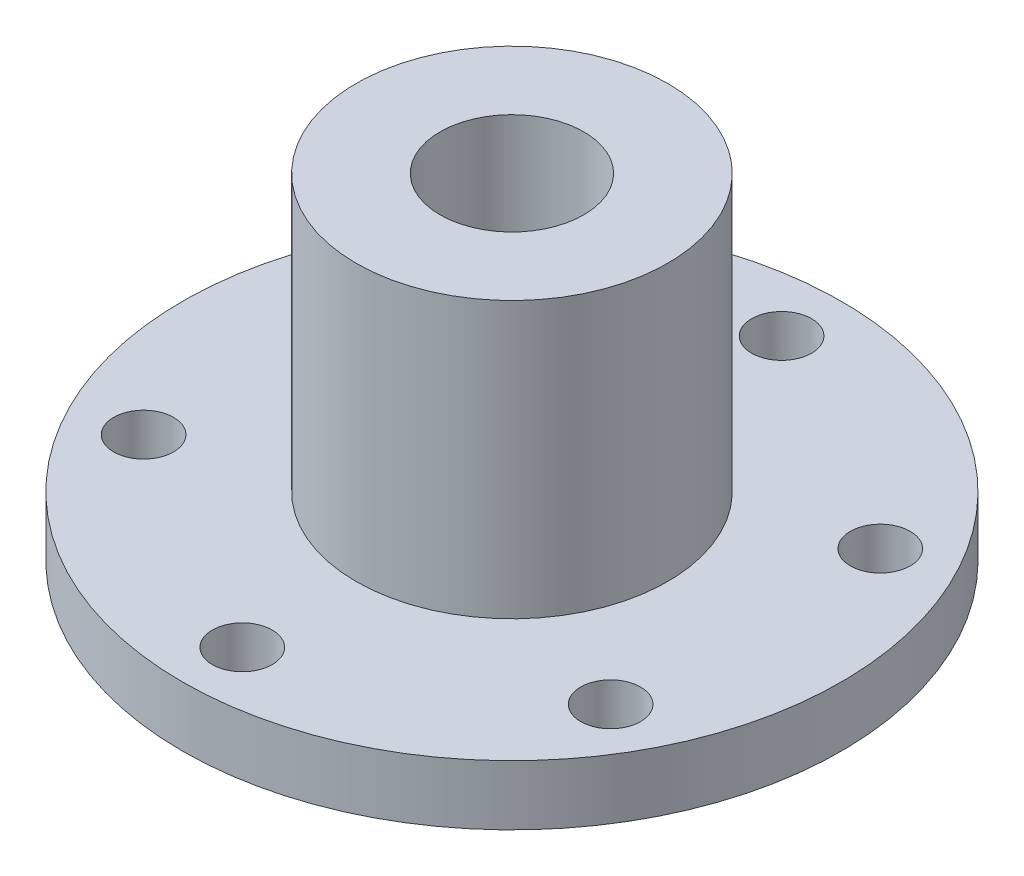
ISO-10303-21;
HEADER;
FILE_DESCRIPTION(('STEP AP214'),'2;1');
FILE_NAME('part.step','',(''),(''),'','','');
FILE_SCHEMA(('AUTOMOTIVE_DESIGN { 1 0 10303 214 1 1 1 1 }'));
ENDSEC;
DATA;
#1=APPLICATION_CONTEXT('core data for automotive mechanical design processes');
#2=APPLICATION_PROTOCOL_DEFINITION('international standard','automotive_design',2000,#1);
#3=PRODUCT_CONTEXT('',#1,'mechanical');
#4=PRODUCT('Part','Part','',(#3));
#5=PRODUCT_RELATED_PRODUCT_CATEGORY('part','',(#4));
#6=PRODUCT_DEFINITION_FORMATION('','',#4);
#7=PRODUCT_DEFINITION_CONTEXT('part definition',#1,'design');
#8=PRODUCT_DEFINITION('design','',#6,#7);
#9=PRODUCT_DEFINITION_SHAPE('','',#8);
#10=(LENGTH_UNIT() NAMED_UNIT(*) SI_UNIT(.MILLI.,.METRE.));
#11=(NAMED_UNIT(*) PLANE_ANGLE_UNIT() SI_UNIT($,.RADIAN.));
#12=(NAMED_UNIT(*) SI_UNIT($,.STERADIAN.) SOLID_ANGLE_UNIT());
#13=UNCERTAINTY_MEASURE_WITH_UNIT(LENGTH_MEASURE(1.E-05),#10,'distance_accuracy_value','');
#14=(GEOMETRIC_REPRESENTATION_CONTEXT(3) GLOBAL_UNCERTAINTY_ASSIGNED_CONTEXT((#13)) GLOBAL_UNIT_ASSIGNED_CONTEXT((#10,
#11,#12)) REPRESENTATION_CONTEXT('',''));
#15=CARTESIAN_POINT('',(0.,0.,0.));
#16=DIRECTION('',(0.,0.,1.));
#17=DIRECTION('',(1.,0.,0.));
#18=AXIS2_PLACEMENT_3D('',#15,#16,#17);
#19=CARTESIAN_POINT('',(0.,5.,0.));
#20=DIRECTION('',(0.,-1.,0.));
#21=DIRECTION('',(0.,0.,-1.));
#22=AXIS2_PLACEMENT_3D('',#19,#20,#21);
#23=CYLINDRICAL_SURFACE('',#22,27.5);
#24=CARTESIAN_POINT('',(0.,5.,0.));
#25=DIRECTION('',(0.,1.,0.));
#26=DIRECTION('',(0.,0.,1.));
#27=AXIS2_PLACEMENT_3D('',#24,#25,#26);
#28=CIRCLE('',#27,27.5);
#29=CARTESIAN_POINT('',(0.,5.,27.5));
#30=VERTEX_POINT('',#29);
#31=EDGE_CURVE('E51',#30,#30,#28,.T.);
#32=ORIENTED_EDGE('',*,*,#31,.F.);
#33=EDGE_LOOP('',(#32));
#34=FACE_BOUND('',#33,.T.);
#35=CARTESIAN_POINT('',(0.,0.,0.));
#36=DIRECTION('',(0.,1.,0.));
#37=DIRECTION('',(0.,0.,1.));
#38=AXIS2_PLACEMENT_3D('',#35,#36,#37);
#39=CIRCLE('',#38,27.5);
#40=CARTESIAN_POINT('',(0.,0.,27.5));
#41=VERTEX_POINT('',#40);
#42=EDGE_CURVE('E59',#41,#41,#39,.T.);
#43=ORIENTED_EDGE('',*,*,#42,.T.);
#44=EDGE_LOOP('',(#43));
#45=FACE_BOUND('',#44,.T.);
#46=ADVANCED_FACE('F39',(#34,#45),#23,.T.);
#47=CARTESIAN_POINT('',(0.,5.,0.));
#48=DIRECTION('',(0.,1.,0.));
#49=DIRECTION('',(0.,0.,1.));
#50=AXIS2_PLACEMENT_3D('',#47,#48,#49);
#51=PLANE('',#50);
#52=CARTESIAN_POINT('',(0.,5.,22.5));
#53=DIRECTION('',(0.,1.,0.));
#54=DIRECTION('',(0.,0.,1.));
#55=AXIS2_PLACEMENT_3D('',#52,#53,#54);
#56=CIRCLE('',#55,2.5);
#57=CARTESIAN_POINT('',(0.,5.,25.));
#58=VERTEX_POINT('',#57);
#59=EDGE_CURVE('E249',#58,#58,#56,.T.);
#60=ORIENTED_EDGE('',*,*,#59,.F.);
#61=EDGE_LOOP('',(#60));
#62=FACE_BOUND('',#61,.T.);
#63=CARTESIAN_POINT('',(-19.4855715851499,5.,11.25));
#64=DIRECTION('',(0.,1.,0.));
#65=DIRECTION('',(0.,0.,1.));
#66=AXIS2_PLACEMENT_3D('',#63,#64,#65);
#67=CIRCLE('',#66,2.5);
#68=CARTESIAN_POINT('',(-19.4855715851499,5.,13.75));
#69=VERTEX_POINT('',#68);
#70=EDGE_CURVE('E281',#69,#69,#67,.T.);
#71=ORIENTED_EDGE('',*,*,#70,.F.);
#72=EDGE_LOOP('',(#71));
#73=FACE_BOUND('',#72,.T.);
#74=CARTESIAN_POINT('',(-19.4855715851499,5.,-11.25));
#75=DIRECTION('',(0.,1.,0.));
#76=DIRECTION('',(0.,0.,1.));
#77=AXIS2_PLACEMENT_3D('',#74,#75,#76);
#78=CIRCLE('',#77,2.5);
#79=CARTESIAN_POINT('',(-19.4855715851499,5.,-8.75000000000001));
#80=VERTEX_POINT('',#79);
#81=EDGE_CURVE('E278',#80,#80,#78,.T.);
#82=ORIENTED_EDGE('',*,*,#81,.F.);
#83=EDGE_LOOP('',(#82));
#84=FACE_BOUND('',#83,.T.);
#85=CARTESIAN_POINT('',(0.,5.,-22.5));
#86=DIRECTION('',(0.,1.,0.));
#87=DIRECTION('',(0.,0.,1.));
#88=AXIS2_PLACEMENT_3D('',#85,#86,#87);
#89=CIRCLE('',#88,2.5);
#90=CARTESIAN_POINT('',(0.,5.,-20.));
#91=VERTEX_POINT('',#90);
#92=EDGE_CURVE('E275',#91,#91,#89,.T.);
#93=ORIENTED_EDGE('',*,*,#92,.F.);
#94=EDGE_LOOP('',(#93));
#95=FACE_BOUND('',#94,.T.);
#96=CARTESIAN_POINT('',(19.4855715851499,5.,-11.25));
#97=DIRECTION('',(0.,1.,0.));
#98=DIRECTION('',(0.,0.,1.));
#99=AXIS2_PLACEMENT_3D('',#96,#97,#98);
#100=CIRCLE('',#99,2.5);
#101=CARTESIAN_POINT('',(19.4855715851499,5.,-8.75));
#102=VERTEX_POINT('',#101);
#103=EDGE_CURVE('E256',#102,#102,#100,.T.);
#104=ORIENTED_EDGE('',*,*,#103,.F.);
#105=EDGE_LOOP('',(#104));
#106=FACE_BOUND('',#105,.T.);
#107=CARTESIAN_POINT('',(19.4855715851499,5.,11.25));
#108=DIRECTION('',(0.,1.,0.));
#109=DIRECTION('',(0.,0.,1.));
#110=AXIS2_PLACEMENT_3D('',#107,#108,#109);
#111=CIRCLE('',#110,2.5);
#112=CARTESIAN_POINT('',(19.4855715851499,5.,13.75));
#113=VERTEX_POINT('',#112);
#114=EDGE_CURVE('E252',#113,#113,#111,.T.);
#115=ORIENTED_EDGE('',*,*,#114,.F.);
#116=EDGE_LOOP('',(#115));
#117=FACE_BOUND('',#116,.T.);
#118=CARTESIAN_POINT('',(0.,5.,0.));
#119=DIRECTION('',(0.,1.,0.));
#120=DIRECTION('',(0.,0.,1.));
#121=AXIS2_PLACEMENT_3D('',#118,#119,#120);
#122=CIRCLE('',#121,13.);
#123=CARTESIAN_POINT('',(0.,5.,13.));
#124=VERTEX_POINT('',#123);
#125=EDGE_CURVE('E10',#124,#124,#122,.T.);
#126=ORIENTED_EDGE('',*,*,#125,.F.);
#127=EDGE_LOOP('',(#126));
#128=FACE_BOUND('',#127,.T.);
#129=ORIENTED_EDGE('',*,*,#31,.T.);
#130=EDGE_LOOP('',(#129));
#131=FACE_BOUND('',#130,.T.);
#132=ADVANCED_FACE('F69',(#62,#73,#84,#95,#106,#117,#128,#131),#51,.T.);
#133=CARTESIAN_POINT('',(0.,0.,0.));
#134=DIRECTION('',(0.,1.,0.));
#135=DIRECTION('',(0.,0.,1.));
#136=AXIS2_PLACEMENT_3D('',#133,#134,#135);
#137=PLANE('',#136);
#138=CARTESIAN_POINT('',(0.,0.,22.5));
#139=DIRECTION('',(0.,-1.,0.));
#140=DIRECTION('',(0.,0.,-1.));
#141=AXIS2_PLACEMENT_3D('',#138,#139,#140);
#142=CIRCLE('',#141,2.5);
#143=CARTESIAN_POINT('',(0.,0.,20.));
#144=VERTEX_POINT('',#143);
#145=EDGE_CURVE('E251',#144,#144,#142,.T.);
#146=ORIENTED_EDGE('',*,*,#145,.F.);
#147=EDGE_LOOP('',(#146));
#148=FACE_BOUND('',#147,.T.);
#149=CARTESIAN_POINT('',(-19.4855715851499,0.,11.25));
#150=DIRECTION('',(0.,-1.,0.));
#151=DIRECTION('',(0.,0.,-1.));
#152=AXIS2_PLACEMENT_3D('',#149,#150,#151);
#153=CIRCLE('',#152,2.5);
#154=CARTESIAN_POINT('',(-19.4855715851499,0.,8.74999999999999));
#155=VERTEX_POINT('',#154);
#156=EDGE_CURVE('E262',#155,#155,#153,.T.);
#157=ORIENTED_EDGE('',*,*,#156,.F.);
#158=EDGE_LOOP('',(#157));
#159=FACE_BOUND('',#158,.T.);
#160=CARTESIAN_POINT('',(-19.4855715851499,0.,-11.25));
#161=DIRECTION('',(0.,-1.,0.));
#162=DIRECTION('',(0.,0.,-1.));
#163=AXIS2_PLACEMENT_3D('',#160,#161,#162);
#164=CIRCLE('',#163,2.5);
#165=CARTESIAN_POINT('',(-19.4855715851499,0.,-13.75));
#166=VERTEX_POINT('',#165);
#167=EDGE_CURVE('E264',#166,#166,#164,.T.);
#168=ORIENTED_EDGE('',*,*,#167,.F.);
#169=EDGE_LOOP('',(#168));
#170=FACE_BOUND('',#169,.T.);
#171=CARTESIAN_POINT('',(0.,0.,-22.5));
#172=DIRECTION('',(0.,-1.,0.));
#173=DIRECTION('',(0.,0.,-1.));
#174=AXIS2_PLACEMENT_3D('',#171,#172,#173);
#175=CIRCLE('',#174,2.5);
#176=CARTESIAN_POINT('',(0.,0.,-25.));
#177=VERTEX_POINT('',#176);
#178=EDGE_CURVE('E268',#177,#177,#175,.T.);
#179=ORIENTED_EDGE('',*,*,#178,.F.);
#180=EDGE_LOOP('',(#179));
#181=FACE_BOUND('',#180,.T.);
#182=CARTESIAN_POINT('',(19.4855715851499,0.,-11.25));
#183=DIRECTION('',(0.,-1.,0.));
#184=DIRECTION('',(0.,0.,-1.));
#185=AXIS2_PLACEMENT_3D('',#182,#183,#184);
#186=CIRCLE('',#185,2.5);
#187=CARTESIAN_POINT('',(19.4855715851499,0.,-13.75));
#188=VERTEX_POINT('',#187);
#189=EDGE_CURVE('E259',#188,#188,#186,.T.);
#190=ORIENTED_EDGE('',*,*,#189,.F.);
#191=EDGE_LOOP('',(#190));
#192=FACE_BOUND('',#191,.T.);
#193=CARTESIAN_POINT('',(19.4855715851499,0.,11.25));
#194=DIRECTION('',(0.,-1.,0.));
#195=DIRECTION('',(0.,0.,-1.));
#196=AXIS2_PLACEMENT_3D('',#193,#194,#195);
#197=CIRCLE('',#196,2.5);
#198=CARTESIAN_POINT('',(19.4855715851499,0.,8.75));
#199=VERTEX_POINT('',#198);
#200=EDGE_CURVE('E253',#199,#199,#197,.T.);
#201=ORIENTED_EDGE('',*,*,#200,.F.);
#202=EDGE_LOOP('',(#201));
#203=FACE_BOUND('',#202,.T.);
#204=CARTESIAN_POINT('',(0.,0.,0.));
#205=DIRECTION('',(0.,-1.,0.));
#206=DIRECTION('',(0.,0.,-1.));
#207=AXIS2_PLACEMENT_3D('',#204,#205,#206);
#208=CIRCLE('',#207,10.);
#209=CARTESIAN_POINT('',(0.,0.,-10.));
#210=VERTEX_POINT('',#209);
#211=EDGE_CURVE('E46',#210,#210,#208,.T.);
#212=ORIENTED_EDGE('',*,*,#211,.F.);
#213=EDGE_LOOP('',(#212));
#214=FACE_BOUND('',#213,.T.);
#215=ORIENTED_EDGE('',*,*,#42,.F.);
#216=EDGE_LOOP('',(#215));
#217=FACE_BOUND('',#216,.T.);
#218=ADVANCED_FACE('F66',(#148,#159,#170,#181,#192,#203,#214,#217),#137,.F.);
#219=CARTESIAN_POINT('',(0.,-3.,0.));
#220=DIRECTION('',(0.,1.,0.));
#221=DIRECTION('',(0.,0.,1.));
#222=AXIS2_PLACEMENT_3D('',#219,#220,#221);
#223=CYLINDRICAL_SURFACE('',#222,10.);
#224=CARTESIAN_POINT('',(0.,-3.,0.));
#225=DIRECTION('',(0.,-1.,0.));
#226=DIRECTION('',(0.,0.,-1.));
#227=AXIS2_PLACEMENT_3D('',#224,#225,#226);
#228=CIRCLE('',#227,10.);
#229=CARTESIAN_POINT('',(0.,-3.,-10.));
#230=VERTEX_POINT('',#229);
#231=EDGE_CURVE('E57',#230,#230,#228,.T.);
#232=ORIENTED_EDGE('',*,*,#231,.F.);
#233=EDGE_LOOP('',(#232));
#234=FACE_BOUND('',#233,.T.);
#235=ORIENTED_EDGE('',*,*,#211,.T.);
#236=EDGE_LOOP('',(#235));
#237=FACE_BOUND('',#236,.T.);
#238=ADVANCED_FACE('F68',(#234,#237),#223,.T.);
#239=CARTESIAN_POINT('',(0.,-3.,0.));
#240=DIRECTION('',(0.,-1.,0.));
#241=DIRECTION('',(0.,0.,-1.));
#242=AXIS2_PLACEMENT_3D('',#239,#240,#241);
#243=PLANE('',#242);
#244=CARTESIAN_POINT('',(0.,-3.,0.));
#245=DIRECTION('',(0.,-1.,0.));
#246=DIRECTION('',(0.,0.,-1.));
#247=AXIS2_PLACEMENT_3D('',#244,#245,#246);
#248=CIRCLE('',#247,7.75);
#249=CARTESIAN_POINT('',(0.,-3.,-7.75));
#250=VERTEX_POINT('',#249);
#251=EDGE_CURVE('E292',#250,#250,#248,.T.);
#252=ORIENTED_EDGE('',*,*,#251,.F.);
#253=EDGE_LOOP('',(#252));
#254=FACE_BOUND('',#253,.T.);
#255=ORIENTED_EDGE('',*,*,#231,.T.);
#256=EDGE_LOOP('',(#255));
#257=FACE_BOUND('',#256,.T.);
#258=ADVANCED_FACE('F76',(#254,#257),#243,.T.);
#259=CARTESIAN_POINT('',(0.,28.,0.));
#260=DIRECTION('',(0.,-1.,0.));
#261=DIRECTION('',(0.,0.,-1.));
#262=AXIS2_PLACEMENT_3D('',#259,#260,#261);
#263=CYLINDRICAL_SURFACE('',#262,13.);
#264=CARTESIAN_POINT('',(0.,28.,0.));
#265=DIRECTION('',(0.,1.,0.));
#266=DIRECTION('',(0.,0.,1.));
#267=AXIS2_PLACEMENT_3D('',#264,#265,#266);
#268=CIRCLE('',#267,13.);
#269=CARTESIAN_POINT('',(0.,28.,13.));
#270=VERTEX_POINT('',#269);
#271=EDGE_CURVE('E55',#270,#270,#268,.T.);
#272=ORIENTED_EDGE('',*,*,#271,.F.);
#273=EDGE_LOOP('',(#272));
#274=FACE_BOUND('',#273,.T.);
#275=ORIENTED_EDGE('',*,*,#125,.T.);
#276=EDGE_LOOP('',(#275));
#277=FACE_BOUND('',#276,.T.);
#278=ADVANCED_FACE('F100',(#274,#277),#263,.T.);
#279=CARTESIAN_POINT('',(0.,28.,0.));
#280=DIRECTION('',(0.,1.,0.));
#281=DIRECTION('',(0.,0.,1.));
#282=AXIS2_PLACEMENT_3D('',#279,#280,#281);
#283=PLANE('',#282);
#284=CARTESIAN_POINT('',(0.,28.,0.));
#285=DIRECTION('',(0.,1.,0.));
#286=DIRECTION('',(0.,0.,1.));
#287=AXIS2_PLACEMENT_3D('',#284,#285,#286);
#288=CIRCLE('',#287,6.);
#289=CARTESIAN_POINT('',(0.,28.,6.));
#290=VERTEX_POINT('',#289);
#291=EDGE_CURVE('E291',#290,#290,#288,.T.);
#292=ORIENTED_EDGE('',*,*,#291,.F.);
#293=EDGE_LOOP('',(#292));
#294=FACE_BOUND('',#293,.T.);
#295=ORIENTED_EDGE('',*,*,#271,.T.);
#296=EDGE_LOOP('',(#295));
#297=FACE_BOUND('',#296,.T.);
#298=ADVANCED_FACE('F104',(#294,#297),#283,.T.);
#299=CARTESIAN_POINT('',(0.,6.,0.));
#300=DIRECTION('',(0.,1.,0.));
#301=DIRECTION('',(0.,0.,1.));
#302=AXIS2_PLACEMENT_3D('',#299,#300,#301);
#303=CYLINDRICAL_SURFACE('',#302,6.);
#304=CARTESIAN_POINT('',(0.,6.,0.));
#305=DIRECTION('',(0.,1.,0.));
#306=DIRECTION('',(0.,0.,1.));
#307=AXIS2_PLACEMENT_3D('',#304,#305,#306);
#308=CIRCLE('',#307,6.);
#309=CARTESIAN_POINT('',(0.,6.,6.));
#310=VERTEX_POINT('',#309);
#311=EDGE_CURVE('E295',#310,#310,#308,.T.);
#312=ORIENTED_EDGE('',*,*,#311,.F.);
#313=EDGE_LOOP('',(#312));
#314=FACE_BOUND('',#313,.T.);
#315=ORIENTED_EDGE('',*,*,#291,.T.);
#316=EDGE_LOOP('',(#315));
#317=FACE_BOUND('',#316,.T.);
#318=ADVANCED_FACE('F113',(#314,#317),#303,.F.);
#319=CARTESIAN_POINT('',(0.,6.,0.));
#320=DIRECTION('',(0.,1.,0.));
#321=DIRECTION('',(0.,0.,1.));
#322=AXIS2_PLACEMENT_3D('',#319,#320,#321);
#323=PLANE('',#322);
#324=CARTESIAN_POINT('',(0.,6.,0.));
#325=DIRECTION('',(0.,1.,0.));
#326=DIRECTION('',(0.,0.,1.));
#327=AXIS2_PLACEMENT_3D('',#324,#325,#326);
#328=CIRCLE('',#327,3.);
#329=CARTESIAN_POINT('',(0.,6.,-3.));
#330=VERTEX_POINT('',#329);
#331=EDGE_CURVE('E42',#330,#330,#328,.T.);
#332=ORIENTED_EDGE('',*,*,#331,.F.);
#333=EDGE_LOOP('',(#332));
#334=FACE_BOUND('',#333,.T.);
#335=ORIENTED_EDGE('',*,*,#311,.T.);
#336=EDGE_LOOP('',(#335));
#337=FACE_BOUND('',#336,.T.);
#338=ADVANCED_FACE('F122',(#334,#337),#323,.T.);
#339=CARTESIAN_POINT('',(0.,-1.,0.));
#340=DIRECTION('',(0.,-1.,0.));
#341=DIRECTION('',(0.,0.,-1.));
#342=AXIS2_PLACEMENT_3D('',#339,#340,#341);
#343=CYLINDRICAL_SURFACE('',#342,7.75);
#344=CARTESIAN_POINT('',(0.,-1.,0.));
#345=DIRECTION('',(0.,-1.,0.));
#346=DIRECTION('',(0.,0.,-1.));
#347=AXIS2_PLACEMENT_3D('',#344,#345,#346);
#348=CIRCLE('',#347,7.75);
#349=CARTESIAN_POINT('',(0.,-1.,-7.75));
#350=VERTEX_POINT('',#349);
#351=EDGE_CURVE('E288',#350,#350,#348,.T.);
#352=ORIENTED_EDGE('',*,*,#351,.F.);
#353=EDGE_LOOP('',(#352));
#354=FACE_BOUND('',#353,.T.);
#355=ORIENTED_EDGE('',*,*,#251,.T.);
#356=EDGE_LOOP('',(#355));
#357=FACE_BOUND('',#356,.T.);
#358=ADVANCED_FACE('F136',(#354,#357),#343,.F.);
#359=CARTESIAN_POINT('',(0.,-1.,0.));
#360=DIRECTION('',(0.,-1.,0.));
#361=DIRECTION('',(0.,0.,-1.));
#362=AXIS2_PLACEMENT_3D('',#359,#360,#361);
#363=PLANE('',#362);
#364=CARTESIAN_POINT('',(0.,-1.,0.));
#365=DIRECTION('',(0.,-1.,0.));
#366=DIRECTION('',(0.,0.,-1.));
#367=AXIS2_PLACEMENT_3D('',#364,#365,#366);
#368=CIRCLE('',#367,3.);
#369=CARTESIAN_POINT('',(0.,-1.,-3.));
#370=VERTEX_POINT('',#369);
#371=EDGE_CURVE('E285',#370,#370,#368,.T.);
#372=ORIENTED_EDGE('',*,*,#371,.F.);
#373=EDGE_LOOP('',(#372));
#374=FACE_BOUND('',#373,.T.);
#375=ORIENTED_EDGE('',*,*,#351,.T.);
#376=EDGE_LOOP('',(#375));
#377=FACE_BOUND('',#376,.T.);
#378=ADVANCED_FACE('F140',(#374,#377),#363,.T.);
#379=CARTESIAN_POINT('',(0.,28.,0.));
#380=DIRECTION('',(0.,-1.,0.));
#381=DIRECTION('',(0.,0.,-1.));
#382=AXIS2_PLACEMENT_3D('',#379,#380,#381);
#383=CYLINDRICAL_SURFACE('',#382,3.);
#384=CARTESIAN_POINT('',(0.,6.,-3.));
#385=CARTESIAN_POINT('',(0.,5.92708333333333,-3.));
#386=CARTESIAN_POINT('',(0.,5.85416666666666,-3.));
#387=CARTESIAN_POINT('',(0.,5.70833333333333,-3.));
#388=CARTESIAN_POINT('',(0.,5.63541666666666,-3.));
#389=CARTESIAN_POINT('',(0.,5.48958333333333,-3.));
#390=CARTESIAN_POINT('',(0.,5.41666666666666,-3.));
#391=CARTESIAN_POINT('',(0.,5.27083333333333,-3.));
#392=CARTESIAN_POINT('',(0.,5.19791666666666,-3.));
#393=CARTESIAN_POINT('',(0.,5.05208333333333,-3.));
#394=CARTESIAN_POINT('',(0.,4.97916666666666,-3.));
#395=CARTESIAN_POINT('',(0.,4.83333333333333,-3.));
#396=CARTESIAN_POINT('',(0.,4.76041666666666,-3.));
#397=CARTESIAN_POINT('',(0.,4.61458333333333,-3.));
#398=CARTESIAN_POINT('',(0.,4.54166666666666,-3.));
#399=CARTESIAN_POINT('',(0.,4.39583333333333,-3.));
#400=CARTESIAN_POINT('',(0.,4.32291666666666,-3.));
#401=CARTESIAN_POINT('',(0.,4.17708333333333,-3.));
#402=CARTESIAN_POINT('',(0.,4.10416666666667,-3.));
#403=CARTESIAN_POINT('',(0.,3.95833333333333,-3.));
#404=CARTESIAN_POINT('',(0.,3.88541666666667,-3.));
#405=CARTESIAN_POINT('',(0.,3.73958333333333,-3.));
#406=CARTESIAN_POINT('',(0.,3.66666666666667,-3.));
#407=CARTESIAN_POINT('',(0.,3.52083333333333,-3.));
#408=CARTESIAN_POINT('',(0.,3.44791666666667,-3.));
#409=CARTESIAN_POINT('',(0.,3.30208333333333,-3.));
#410=CARTESIAN_POINT('',(0.,3.22916666666667,-3.));
#411=CARTESIAN_POINT('',(0.,3.08333333333333,-3.));
#412=CARTESIAN_POINT('',(0.,3.01041666666667,-3.));
#413=CARTESIAN_POINT('',(0.,2.86458333333333,-3.));
#414=CARTESIAN_POINT('',(0.,2.79166666666667,-3.));
#415=CARTESIAN_POINT('',(0.,2.64583333333333,-3.));
#416=CARTESIAN_POINT('',(0.,2.57291666666667,-3.));
#417=CARTESIAN_POINT('',(0.,2.42708333333333,-3.));
#418=CARTESIAN_POINT('',(0.,2.35416666666667,-3.));
#419=CARTESIAN_POINT('',(0.,2.20833333333333,-3.));
#420=CARTESIAN_POINT('',(0.,2.13541666666667,-3.));
#421=CARTESIAN_POINT('',(0.,1.98958333333333,-3.));
#422=CARTESIAN_POINT('',(0.,1.91666666666666,-3.));
#423=CARTESIAN_POINT('',(0.,1.77083333333333,-3.));
#424=CARTESIAN_POINT('',(0.,1.69791666666666,-3.));
#425=CARTESIAN_POINT('',(0.,1.55208333333333,-3.));
#426=CARTESIAN_POINT('',(0.,1.47916666666666,-3.));
#427=CARTESIAN_POINT('',(0.,1.33333333333333,-3.));
#428=CARTESIAN_POINT('',(0.,1.26041666666667,-3.));
#429=CARTESIAN_POINT('',(0.,1.11458333333333,-3.));
#430=CARTESIAN_POINT('',(0.,1.04166666666667,-3.));
#431=CARTESIAN_POINT('',(0.,0.895833333333332,-3.));
#432=CARTESIAN_POINT('',(0.,0.822916666666666,-3.));
#433=CARTESIAN_POINT('',(0.,0.677083333333333,-3.));
#434=CARTESIAN_POINT('',(0.,0.604166666666665,-3.));
#435=CARTESIAN_POINT('',(0.,0.458333333333331,-3.));
#436=CARTESIAN_POINT('',(0.,0.385416666666666,-3.));
#437=CARTESIAN_POINT('',(0.,0.239583333333334,-3.));
#438=CARTESIAN_POINT('',(0.,0.166666666666667,-3.));
#439=CARTESIAN_POINT('',(0.,0.0208333333333334,-3.));
#440=CARTESIAN_POINT('',(0.,-0.0520833333333334,-3.));
#441=CARTESIAN_POINT('',(0.,-0.197916666666667,-3.));
#442=CARTESIAN_POINT('',(0.,-0.270833333333334,-3.));
#443=CARTESIAN_POINT('',(0.,-0.416666666666667,-3.));
#444=CARTESIAN_POINT('',(0.,-0.489583333333334,-3.));
#445=CARTESIAN_POINT('',(0.,-0.635416666666667,-3.));
#446=CARTESIAN_POINT('',(0.,-0.708333333333334,-3.));
#447=CARTESIAN_POINT('',(0.,-0.854166666666667,-3.));
#448=CARTESIAN_POINT('',(0.,-0.927083333333334,-3.));
#449=CARTESIAN_POINT('',(0.,-1.,-3.));
#450=B_SPLINE_CURVE_WITH_KNOTS('',3,(#384,#385,#386,#387,#388,#389,#390,#391,#392,#393,#394,
#395,#396,#397,#398,#399,#400,#401,#402,#403,#404,#405,#406,#407,#408,#409,#410,#411,#412,#413,
#414,#415,#416,#417,#418,#419,#420,#421,#422,#423,#424,#425,#426,#427,#428,#429,#430,#431,#432,
#433,#434,#435,#436,#437,#438,#439,#440,#441,#442,#443,#444,#445,#446,#447,#448,#449),
.UNSPECIFIED.,.F.,.F.,(4,2,2,2,2,2,2,2,2,2,2,2,2,2,2,2,2,2,2,2,2,2,2,2,2,2,2,2,2,2,2,2,4),(0.,
0.21875,0.4375,0.656250000000001,0.875000000000001,1.09375,1.3125,1.53125,1.75,1.96875,2.1875,
2.40625,2.625,2.84375,3.0625,3.28125,3.5,3.71875,3.9375,4.15625,4.375,4.59375,4.8125,5.03125,
5.25,5.46875,5.6875,5.90625,6.125,6.34375,6.5625,6.78125,7.),.UNSPECIFIED.);
#451=EDGE_CURVE('BSEAM156',#330,#370,#450,.T.);
#452=ORIENTED_EDGE('',*,*,#331,.T.);
#453=ORIENTED_EDGE('',*,*,#371,.T.);
#454=ORIENTED_EDGE('',*,*,#451,.T.);
#455=ORIENTED_EDGE('',*,*,#451,.F.);
#456=EDGE_LOOP('',(#452,#454,#453,#455));
#457=FACE_BOUND('',#456,.T.);
#458=ADVANCED_FACE('F156',(#457),#383,.F.);
#459=CARTESIAN_POINT('',(19.4855715851499,28.,11.25));
#460=DIRECTION('',(0.,-1.,0.));
#461=DIRECTION('',(0.,0.,-1.));
#462=AXIS2_PLACEMENT_3D('',#459,#460,#461);
#463=CYLINDRICAL_SURFACE('',#462,2.5);
#464=ORIENTED_EDGE('',*,*,#114,.T.);
#465=EDGE_LOOP('',(#464));
#466=FACE_BOUND('',#465,.T.);
#467=ORIENTED_EDGE('',*,*,#200,.T.);
#468=EDGE_LOOP('',(#467));
#469=FACE_BOUND('',#468,.T.);
#470=ADVANCED_FACE('F164',(#466,#469),#463,.F.);
#471=CARTESIAN_POINT('',(19.4855715851499,28.,-11.25));
#472=DIRECTION('',(0.,-1.,0.));
#473=DIRECTION('',(0.,0.,-1.));
#474=AXIS2_PLACEMENT_3D('',#471,#472,#473);
#475=CYLINDRICAL_SURFACE('',#474,2.5);
#476=ORIENTED_EDGE('',*,*,#103,.T.);
#477=EDGE_LOOP('',(#476));
#478=FACE_BOUND('',#477,.T.);
#479=ORIENTED_EDGE('',*,*,#189,.T.);
#480=EDGE_LOOP('',(#479));
#481=FACE_BOUND('',#480,.T.);
#482=ADVANCED_FACE('F192',(#478,#481),#475,.F.);
#483=CARTESIAN_POINT('',(0.,28.,-22.5));
#484=DIRECTION('',(0.,-1.,0.));
#485=DIRECTION('',(0.,0.,-1.));
#486=AXIS2_PLACEMENT_3D('',#483,#484,#485);
#487=CYLINDRICAL_SURFACE('',#486,2.5);
#488=ORIENTED_EDGE('',*,*,#92,.T.);
#489=EDGE_LOOP('',(#488));
#490=FACE_BOUND('',#489,.T.);
#491=ORIENTED_EDGE('',*,*,#178,.T.);
#492=EDGE_LOOP('',(#491));
#493=FACE_BOUND('',#492,.T.);
#494=ADVANCED_FACE('F201',(#490,#493),#487,.F.);
#495=CARTESIAN_POINT('',(-19.4855715851499,28.,-11.25));
#496=DIRECTION('',(0.,-1.,0.));
#497=DIRECTION('',(0.,0.,-1.));
#498=AXIS2_PLACEMENT_3D('',#495,#496,#497);
#499=CYLINDRICAL_SURFACE('',#498,2.5);
#500=ORIENTED_EDGE('',*,*,#81,.T.);
#501=EDGE_LOOP('',(#500));
#502=FACE_BOUND('',#501,.T.);
#503=ORIENTED_EDGE('',*,*,#167,.T.);
#504=EDGE_LOOP('',(#503));
#505=FACE_BOUND('',#504,.T.);
#506=ADVANCED_FACE('F210',(#502,#505),#499,.F.);
#507=CARTESIAN_POINT('',(-19.4855715851499,28.,11.25));
#508=DIRECTION('',(0.,-1.,0.));
#509=DIRECTION('',(0.,0.,-1.));
#510=AXIS2_PLACEMENT_3D('',#507,#508,#509);
#511=CYLINDRICAL_SURFACE('',#510,2.5);
#512=ORIENTED_EDGE('',*,*,#70,.T.);
#513=EDGE_LOOP('',(#512));
#514=FACE_BOUND('',#513,.T.);
#515=ORIENTED_EDGE('',*,*,#156,.T.);
#516=EDGE_LOOP('',(#515));
#517=FACE_BOUND('',#516,.T.);
#518=ADVANCED_FACE('F219',(#514,#517),#511,.F.);
#519=CARTESIAN_POINT('',(0.,28.,22.5));
#520=DIRECTION('',(0.,-1.,0.));
#521=DIRECTION('',(0.,0.,-1.));
#522=AXIS2_PLACEMENT_3D('',#519,#520,#521);
#523=CYLINDRICAL_SURFACE('',#522,2.5);
#524=ORIENTED_EDGE('',*,*,#59,.T.);
#525=EDGE_LOOP('',(#524));
#526=FACE_BOUND('',#525,.T.);
#527=ORIENTED_EDGE('',*,*,#145,.T.);
#528=EDGE_LOOP('',(#527));
#529=FACE_BOUND('',#528,.T.);
#530=ADVANCED_FACE('F228',(#526,#529),#523,.F.);
#531=CLOSED_SHELL('',(#46,#132,#218,#238,#258,#278,#298,#318,#338,#358,#378,#458,#470,#482,#494,
#506,#518,#530));
#532=MANIFOLD_SOLID_BREP('B2',#531);
#533=ADVANCED_BREP_SHAPE_REPRESENTATION('',(#18,#532),#14);
#534=SHAPE_DEFINITION_REPRESENTATION(#9,#533);
ENDSEC;
END-ISO-10303-21;
